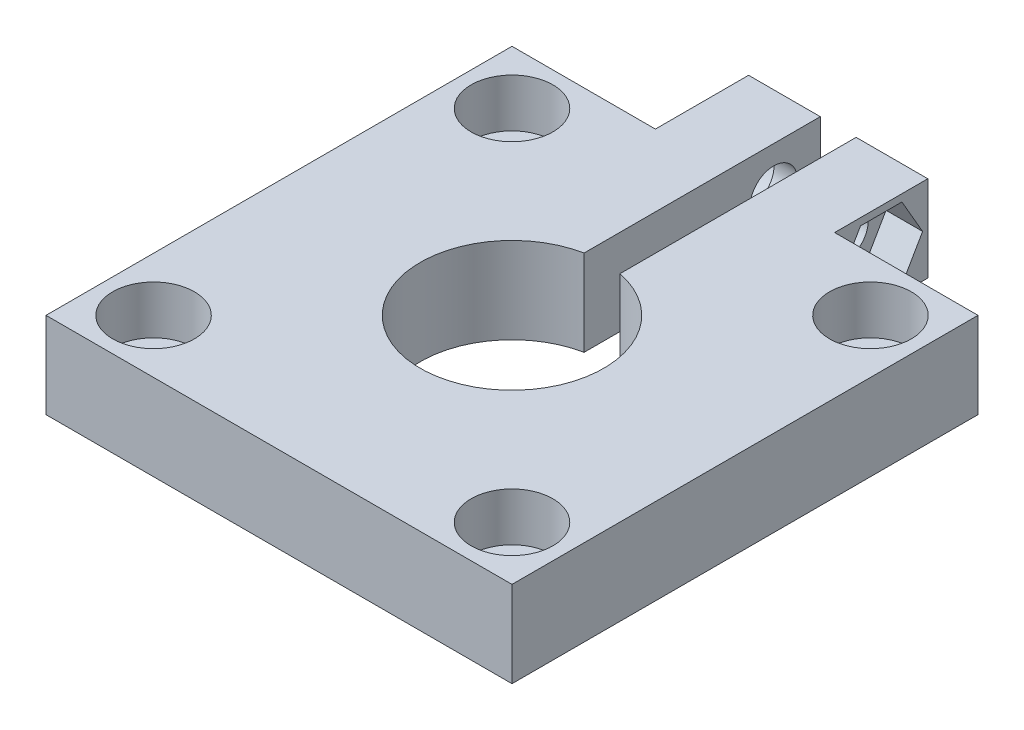
ISO-10303-21;
HEADER;
FILE_DESCRIPTION(('STEP AP214'),'2;1');
FILE_NAME('part.step','',(''),(''),'','','');
FILE_SCHEMA(('AUTOMOTIVE_DESIGN { 1 0 10303 214 1 1 1 1 }'));
ENDSEC;
DATA;
#1=APPLICATION_CONTEXT('core data for automotive mechanical design processes');
#2=APPLICATION_PROTOCOL_DEFINITION('international standard','automotive_design',2000,#1);
#3=PRODUCT_CONTEXT('',#1,'mechanical');
#4=PRODUCT('Part','Part','',(#3));
#5=PRODUCT_RELATED_PRODUCT_CATEGORY('part','',(#4));
#6=PRODUCT_DEFINITION_FORMATION('','',#4);
#7=PRODUCT_DEFINITION_CONTEXT('part definition',#1,'design');
#8=PRODUCT_DEFINITION('design','',#6,#7);
#9=PRODUCT_DEFINITION_SHAPE('','',#8);
#10=(LENGTH_UNIT() NAMED_UNIT(*) SI_UNIT(.MILLI.,.METRE.));
#11=(NAMED_UNIT(*) PLANE_ANGLE_UNIT() SI_UNIT($,.RADIAN.));
#12=(NAMED_UNIT(*) SI_UNIT($,.STERADIAN.) SOLID_ANGLE_UNIT());
#13=UNCERTAINTY_MEASURE_WITH_UNIT(LENGTH_MEASURE(1.E-05),#10,'distance_accuracy_value','');
#14=(GEOMETRIC_REPRESENTATION_CONTEXT(3) GLOBAL_UNCERTAINTY_ASSIGNED_CONTEXT((#13)) GLOBAL_UNIT_ASSIGNED_CONTEXT((#10,
#11,#12)) REPRESENTATION_CONTEXT('',''));
#15=CARTESIAN_POINT('',(0.,0.,0.));
#16=DIRECTION('',(0.,0.,1.));
#17=DIRECTION('',(1.,0.,0.));
#18=AXIS2_PLACEMENT_3D('',#15,#16,#17);
#19=CARTESIAN_POINT('',(-12.5,6.,-39.));
#20=DIRECTION('',(-1.,0.,0.));
#21=DIRECTION('',(0.,0.,1.));
#22=AXIS2_PLACEMENT_3D('',#19,#20,#21);
#23=CYLINDRICAL_SURFACE('',#22,3.3);
#24=CARTESIAN_POINT('',(2.5,6.,-39.));
#25=DIRECTION('',(1.,0.,0.));
#26=DIRECTION('',(0.,0.,-1.));
#27=AXIS2_PLACEMENT_3D('',#24,#25,#26);
#28=CIRCLE('',#27,3.3);
#29=CARTESIAN_POINT('',(2.5,6.,-42.3));
#30=VERTEX_POINT('',#29);
#31=EDGE_CURVE('E228',#30,#30,#28,.T.);
#32=ORIENTED_EDGE('',*,*,#31,.F.);
#33=EDGE_LOOP('',(#32));
#34=FACE_BOUND('',#33,.T.);
#35=CARTESIAN_POINT('',(7.4,6.,-39.));
#36=DIRECTION('',(1.,0.,0.));
#37=DIRECTION('',(0.,0.,-1.));
#38=AXIS2_PLACEMENT_3D('',#35,#36,#37);
#39=CIRCLE('',#38,3.3);
#40=CARTESIAN_POINT('',(7.4,6.,-42.3));
#41=VERTEX_POINT('',#40);
#42=EDGE_CURVE('E39',#41,#41,#39,.F.);
#43=ORIENTED_EDGE('',*,*,#42,.F.);
#44=EDGE_LOOP('',(#43));
#45=FACE_BOUND('',#44,.T.);
#46=ADVANCED_FACE('F35',(#34,#45),#23,.F.);
#47=CARTESIAN_POINT('',(-32.5,12.,-32.5));
#48=DIRECTION('',(0.,0.,1.));
#49=DIRECTION('',(1.,0.,0.));
#50=AXIS2_PLACEMENT_3D('',#47,#48,#49);
#51=PLANE('',#50);
#52=DIRECTION('',(-1.,0.,0.));
#53=VECTOR('',#52,1.);
#54=CARTESIAN_POINT('',(-32.5,0.,-32.5));
#55=LINE('',#54,#53);
#56=CARTESIAN_POINT('',(32.5,0.,-32.5));
#57=VERTEX_POINT('',#56);
#58=CARTESIAN_POINT('',(12.5,0.,-32.5));
#59=VERTEX_POINT('',#58);
#60=EDGE_CURVE('E303',#57,#59,#55,.T.);
#61=ORIENTED_EDGE('',*,*,#60,.T.);
#62=DIRECTION('',(0.,1.,0.));
#63=VECTOR('',#62,1.);
#64=CARTESIAN_POINT('',(12.5,0.,-32.5));
#65=LINE('',#64,#63);
#66=CARTESIAN_POINT('',(12.5,12.,-32.5));
#67=VERTEX_POINT('',#66);
#68=EDGE_CURVE('E59',#59,#67,#65,.T.);
#69=ORIENTED_EDGE('',*,*,#68,.T.);
#70=DIRECTION('',(-1.,0.,0.));
#71=VECTOR('',#70,1.);
#72=CARTESIAN_POINT('',(-32.5,12.,-32.5));
#73=LINE('',#72,#71);
#74=CARTESIAN_POINT('',(32.5,12.,-32.5));
#75=VERTEX_POINT('',#74);
#76=EDGE_CURVE('E293',#75,#67,#73,.T.);
#77=ORIENTED_EDGE('',*,*,#76,.F.);
#78=DIRECTION('',(0.,-1.,0.));
#79=VECTOR('',#78,1.);
#80=CARTESIAN_POINT('',(32.5,12.,-32.5));
#81=LINE('',#80,#79);
#82=EDGE_CURVE('E316',#75,#57,#81,.T.);
#83=ORIENTED_EDGE('',*,*,#82,.T.);
#84=EDGE_LOOP('',(#61,#69,#77,#83));
#85=FACE_BOUND('',#84,.T.);
#86=ADVANCED_FACE('F343',(#85),#51,.F.);
#87=CARTESIAN_POINT('',(32.5,12.,-32.5));
#88=DIRECTION('',(-1.,0.,0.));
#89=DIRECTION('',(0.,0.,1.));
#90=AXIS2_PLACEMENT_3D('',#87,#88,#89);
#91=PLANE('',#90);
#92=DIRECTION('',(0.,0.,-1.));
#93=VECTOR('',#92,1.);
#94=CARTESIAN_POINT('',(32.5,0.,-32.5));
#95=LINE('',#94,#93);
#96=CARTESIAN_POINT('',(32.5,0.,32.5));
#97=VERTEX_POINT('',#96);
#98=EDGE_CURVE('E285',#97,#57,#95,.T.);
#99=ORIENTED_EDGE('',*,*,#98,.T.);
#100=ORIENTED_EDGE('',*,*,#82,.F.);
#101=DIRECTION('',(0.,0.,-1.));
#102=VECTOR('',#101,1.);
#103=CARTESIAN_POINT('',(32.5,12.,-32.5));
#104=LINE('',#103,#102);
#105=CARTESIAN_POINT('',(32.5,12.,32.5));
#106=VERTEX_POINT('',#105);
#107=EDGE_CURVE('E288',#106,#75,#104,.T.);
#108=ORIENTED_EDGE('',*,*,#107,.F.);
#109=DIRECTION('',(0.,-1.,0.));
#110=VECTOR('',#109,1.);
#111=CARTESIAN_POINT('',(32.5,12.,32.5));
#112=LINE('',#111,#110);
#113=EDGE_CURVE('E299',#106,#97,#112,.T.);
#114=ORIENTED_EDGE('',*,*,#113,.T.);
#115=EDGE_LOOP('',(#99,#100,#108,#114));
#116=FACE_BOUND('',#115,.T.);
#117=ADVANCED_FACE('F37',(#116),#91,.F.);
#118=CARTESIAN_POINT('',(-12.5,12.,-32.5));
#119=VERTEX_POINT('',#118);
#120=CARTESIAN_POINT('',(-32.5,12.,-32.5));
#121=VERTEX_POINT('',#120);
#122=EDGE_CURVE('E291',#119,#121,#73,.T.);
#123=ORIENTED_EDGE('',*,*,#122,.F.);
#124=DIRECTION('',(0.,1.,0.));
#125=VECTOR('',#124,1.);
#126=CARTESIAN_POINT('',(-12.5,0.,-32.5));
#127=LINE('',#126,#125);
#128=CARTESIAN_POINT('',(-12.5,0.,-32.5));
#129=VERTEX_POINT('',#128);
#130=EDGE_CURVE('E265',#129,#119,#127,.T.);
#131=ORIENTED_EDGE('',*,*,#130,.F.);
#132=CARTESIAN_POINT('',(-32.5,0.,-32.5));
#133=VERTEX_POINT('',#132);
#134=EDGE_CURVE('E302',#129,#133,#55,.T.);
#135=ORIENTED_EDGE('',*,*,#134,.T.);
#136=DIRECTION('',(0.,-1.,0.));
#137=VECTOR('',#136,1.);
#138=CARTESIAN_POINT('',(-32.5,12.,-32.5));
#139=LINE('',#138,#137);
#140=EDGE_CURVE('E313',#121,#133,#139,.T.);
#141=ORIENTED_EDGE('',*,*,#140,.F.);
#142=EDGE_LOOP('',(#123,#131,#135,#141));
#143=FACE_BOUND('',#142,.T.);
#144=ADVANCED_FACE('F359',(#143),#51,.F.);
#145=CARTESIAN_POINT('',(-32.5,12.,-32.5));
#146=DIRECTION('',(1.,0.,0.));
#147=DIRECTION('',(0.,0.,-1.));
#148=AXIS2_PLACEMENT_3D('',#145,#146,#147);
#149=PLANE('',#148);
#150=DIRECTION('',(0.,0.,1.));
#151=VECTOR('',#150,1.);
#152=CARTESIAN_POINT('',(-32.5,0.,-32.5));
#153=LINE('',#152,#151);
#154=CARTESIAN_POINT('',(-32.5,0.,32.5));
#155=VERTEX_POINT('',#154);
#156=EDGE_CURVE('E305',#133,#155,#153,.T.);
#157=ORIENTED_EDGE('',*,*,#156,.T.);
#158=DIRECTION('',(0.,-1.,0.));
#159=VECTOR('',#158,1.);
#160=CARTESIAN_POINT('',(-32.5,12.,32.5));
#161=LINE('',#160,#159);
#162=CARTESIAN_POINT('',(-32.5,12.,32.5));
#163=VERTEX_POINT('',#162);
#164=EDGE_CURVE('E310',#163,#155,#161,.T.);
#165=ORIENTED_EDGE('',*,*,#164,.F.);
#166=DIRECTION('',(0.,0.,1.));
#167=VECTOR('',#166,1.);
#168=CARTESIAN_POINT('',(-32.5,12.,-32.5));
#169=LINE('',#168,#167);
#170=EDGE_CURVE('E295',#121,#163,#169,.T.);
#171=ORIENTED_EDGE('',*,*,#170,.F.);
#172=ORIENTED_EDGE('',*,*,#140,.T.);
#173=EDGE_LOOP('',(#157,#165,#171,#172));
#174=FACE_BOUND('',#173,.T.);
#175=ADVANCED_FACE('F356',(#174),#149,.F.);
#176=CARTESIAN_POINT('',(-32.5,12.,32.5));
#177=DIRECTION('',(0.,0.,-1.));
#178=DIRECTION('',(-1.,0.,0.));
#179=AXIS2_PLACEMENT_3D('',#176,#177,#178);
#180=PLANE('',#179);
#181=DIRECTION('',(1.,0.,0.));
#182=VECTOR('',#181,1.);
#183=CARTESIAN_POINT('',(-32.5,0.,32.5));
#184=LINE('',#183,#182);
#185=EDGE_CURVE('E292',#155,#97,#184,.T.);
#186=ORIENTED_EDGE('',*,*,#185,.T.);
#187=ORIENTED_EDGE('',*,*,#113,.F.);
#188=DIRECTION('',(1.,0.,0.));
#189=VECTOR('',#188,1.);
#190=CARTESIAN_POINT('',(-32.5,12.,32.5));
#191=LINE('',#190,#189);
#192=EDGE_CURVE('E297',#163,#106,#191,.T.);
#193=ORIENTED_EDGE('',*,*,#192,.F.);
#194=ORIENTED_EDGE('',*,*,#164,.T.);
#195=EDGE_LOOP('',(#186,#187,#193,#194));
#196=FACE_BOUND('',#195,.T.);
#197=ADVANCED_FACE('F351',(#196),#180,.F.);
#198=CARTESIAN_POINT('',(32.5,12.,32.5));
#199=DIRECTION('',(0.,1.,0.));
#200=DIRECTION('',(0.,0.,1.));
#201=AXIS2_PLACEMENT_3D('',#198,#199,#200);
#202=PLANE('',#201);
#203=CARTESIAN_POINT('',(-25.,12.,25.));
#204=DIRECTION('',(0.,1.,0.));
#205=DIRECTION('',(0.,0.,1.));
#206=AXIS2_PLACEMENT_3D('',#203,#204,#205);
#207=CIRCLE('',#206,5.7);
#208=CARTESIAN_POINT('',(-25.,12.,30.7));
#209=VERTEX_POINT('',#208);
#210=EDGE_CURVE('E513',#209,#209,#207,.T.);
#211=ORIENTED_EDGE('',*,*,#210,.F.);
#212=EDGE_LOOP('',(#211));
#213=FACE_BOUND('',#212,.T.);
#214=CARTESIAN_POINT('',(25.,12.,25.));
#215=DIRECTION('',(0.,1.,0.));
#216=DIRECTION('',(0.,0.,1.));
#217=AXIS2_PLACEMENT_3D('',#214,#215,#216);
#218=CIRCLE('',#217,5.7);
#219=CARTESIAN_POINT('',(25.,12.,30.7));
#220=VERTEX_POINT('',#219);
#221=EDGE_CURVE('E524',#220,#220,#218,.T.);
#222=ORIENTED_EDGE('',*,*,#221,.F.);
#223=EDGE_LOOP('',(#222));
#224=FACE_BOUND('',#223,.T.);
#225=CARTESIAN_POINT('',(25.,12.,-25.));
#226=DIRECTION('',(0.,1.,0.));
#227=DIRECTION('',(0.,0.,1.));
#228=AXIS2_PLACEMENT_3D('',#225,#226,#227);
#229=CIRCLE('',#228,5.7);
#230=CARTESIAN_POINT('',(25.,12.,-19.3));
#231=VERTEX_POINT('',#230);
#232=EDGE_CURVE('E536',#231,#231,#229,.T.);
#233=ORIENTED_EDGE('',*,*,#232,.F.);
#234=EDGE_LOOP('',(#233));
#235=FACE_BOUND('',#234,.T.);
#236=CARTESIAN_POINT('',(-25.,12.,-25.));
#237=DIRECTION('',(0.,1.,0.));
#238=DIRECTION('',(0.,0.,1.));
#239=AXIS2_PLACEMENT_3D('',#236,#237,#238);
#240=CIRCLE('',#239,5.7);
#241=CARTESIAN_POINT('',(-25.,12.,-19.3));
#242=VERTEX_POINT('',#241);
#243=EDGE_CURVE('E548',#242,#242,#240,.T.);
#244=ORIENTED_EDGE('',*,*,#243,.F.);
#245=EDGE_LOOP('',(#244));
#246=FACE_BOUND('',#245,.T.);
#247=DIRECTION('',(0.,0.,-1.));
#248=VECTOR('',#247,1.);
#249=CARTESIAN_POINT('',(2.5,12.,-52.5));
#250=LINE('',#249,#248);
#251=CARTESIAN_POINT('',(2.5,12.,-12.5534855717446));
#252=VERTEX_POINT('',#251);
#253=CARTESIAN_POINT('',(2.5,12.,-45.5));
#254=VERTEX_POINT('',#253);
#255=EDGE_CURVE('E268',#252,#254,#250,.T.);
#256=ORIENTED_EDGE('',*,*,#255,.F.);
#257=CARTESIAN_POINT('',(0.,12.,0.));
#258=DIRECTION('',(0.,1.,0.));
#259=DIRECTION('',(0.,0.,1.));
#260=AXIS2_PLACEMENT_3D('',#257,#258,#259);
#261=CIRCLE('',#260,12.8);
#262=CARTESIAN_POINT('',(-2.5,12.,-12.5534855717446));
#263=VERTEX_POINT('',#262);
#264=EDGE_CURVE('E279',#263,#252,#261,.T.);
#265=ORIENTED_EDGE('',*,*,#264,.F.);
#266=DIRECTION('',(0.,0.,1.));
#267=VECTOR('',#266,1.);
#268=CARTESIAN_POINT('',(-2.5,12.,-52.5));
#269=LINE('',#268,#267);
#270=CARTESIAN_POINT('',(-2.5,12.,-45.5));
#271=VERTEX_POINT('',#270);
#272=EDGE_CURVE('E276',#271,#263,#269,.T.);
#273=ORIENTED_EDGE('',*,*,#272,.F.);
#274=DIRECTION('',(-1.,0.,0.));
#275=VECTOR('',#274,1.);
#276=CARTESIAN_POINT('',(-2.5,12.,-45.5));
#277=LINE('',#276,#275);
#278=CARTESIAN_POINT('',(-12.5,12.,-45.5));
#279=VERTEX_POINT('',#278);
#280=EDGE_CURVE('E248',#271,#279,#277,.T.);
#281=ORIENTED_EDGE('',*,*,#280,.T.);
#282=DIRECTION('',(0.,0.,1.));
#283=VECTOR('',#282,1.);
#284=CARTESIAN_POINT('',(-12.5,12.,-32.5));
#285=LINE('',#284,#283);
#286=EDGE_CURVE('E257',#279,#119,#285,.T.);
#287=ORIENTED_EDGE('',*,*,#286,.T.);
#288=ORIENTED_EDGE('',*,*,#122,.T.);
#289=ORIENTED_EDGE('',*,*,#170,.T.);
#290=ORIENTED_EDGE('',*,*,#192,.T.);
#291=ORIENTED_EDGE('',*,*,#107,.T.);
#292=ORIENTED_EDGE('',*,*,#76,.T.);
#293=DIRECTION('',(0.,0.,-1.));
#294=VECTOR('',#293,1.);
#295=CARTESIAN_POINT('',(12.5,12.,-32.5));
#296=LINE('',#295,#294);
#297=CARTESIAN_POINT('',(12.5,12.,-45.5));
#298=VERTEX_POINT('',#297);
#299=EDGE_CURVE('E234',#67,#298,#296,.T.);
#300=ORIENTED_EDGE('',*,*,#299,.T.);
#301=DIRECTION('',(-1.,0.,0.));
#302=VECTOR('',#301,1.);
#303=CARTESIAN_POINT('',(12.5,12.,-45.5));
#304=LINE('',#303,#302);
#305=EDGE_CURVE('E239',#298,#254,#304,.T.);
#306=ORIENTED_EDGE('',*,*,#305,.T.);
#307=EDGE_LOOP('',(#256,#265,#273,#281,#287,#288,#289,#290,#291,#292,#300,#306));
#308=FACE_BOUND('',#307,.T.);
#309=ADVANCED_FACE('F327',(#213,#224,#235,#246,#308),#202,.T.);
#310=CARTESIAN_POINT('',(32.5,0.,32.5));
#311=DIRECTION('',(0.,1.,0.));
#312=DIRECTION('',(0.,0.,1.));
#313=AXIS2_PLACEMENT_3D('',#310,#311,#312);
#314=PLANE('',#313);
#315=CARTESIAN_POINT('',(-25.,0.,25.));
#316=DIRECTION('',(0.,1.,0.));
#317=DIRECTION('',(0.,0.,1.));
#318=AXIS2_PLACEMENT_3D('',#315,#316,#317);
#319=CIRCLE('',#318,3.75);
#320=CARTESIAN_POINT('',(-25.,0.,28.75));
#321=VERTEX_POINT('',#320);
#322=EDGE_CURVE('E521',#321,#321,#319,.T.);
#323=ORIENTED_EDGE('',*,*,#322,.T.);
#324=EDGE_LOOP('',(#323));
#325=FACE_BOUND('',#324,.T.);
#326=CARTESIAN_POINT('',(25.,0.,25.));
#327=DIRECTION('',(0.,1.,0.));
#328=DIRECTION('',(0.,0.,1.));
#329=AXIS2_PLACEMENT_3D('',#326,#327,#328);
#330=CIRCLE('',#329,3.75);
#331=CARTESIAN_POINT('',(25.,0.,28.75));
#332=VERTEX_POINT('',#331);
#333=EDGE_CURVE('E533',#332,#332,#330,.T.);
#334=ORIENTED_EDGE('',*,*,#333,.T.);
#335=EDGE_LOOP('',(#334));
#336=FACE_BOUND('',#335,.T.);
#337=CARTESIAN_POINT('',(25.,0.,-25.));
#338=DIRECTION('',(0.,1.,0.));
#339=DIRECTION('',(0.,0.,1.));
#340=AXIS2_PLACEMENT_3D('',#337,#338,#339);
#341=CIRCLE('',#340,3.75);
#342=CARTESIAN_POINT('',(25.,0.,-21.25));
#343=VERTEX_POINT('',#342);
#344=EDGE_CURVE('E545',#343,#343,#341,.T.);
#345=ORIENTED_EDGE('',*,*,#344,.T.);
#346=EDGE_LOOP('',(#345));
#347=FACE_BOUND('',#346,.T.);
#348=CARTESIAN_POINT('',(-25.,0.,-25.));
#349=DIRECTION('',(0.,1.,0.));
#350=DIRECTION('',(0.,0.,1.));
#351=AXIS2_PLACEMENT_3D('',#348,#349,#350);
#352=CIRCLE('',#351,3.75);
#353=CARTESIAN_POINT('',(-25.,0.,-21.25));
#354=VERTEX_POINT('',#353);
#355=EDGE_CURVE('E189',#354,#354,#352,.T.);
#356=ORIENTED_EDGE('',*,*,#355,.T.);
#357=EDGE_LOOP('',(#356));
#358=FACE_BOUND('',#357,.T.);
#359=CARTESIAN_POINT('',(0.,0.,0.));
#360=DIRECTION('',(0.,1.,0.));
#361=DIRECTION('',(0.,0.,1.));
#362=AXIS2_PLACEMENT_3D('',#359,#360,#361);
#363=CIRCLE('',#362,12.8);
#364=CARTESIAN_POINT('',(-2.5,0.,-12.5534855717446));
#365=VERTEX_POINT('',#364);
#366=CARTESIAN_POINT('',(2.5,0.,-12.5534855717446));
#367=VERTEX_POINT('',#366);
#368=EDGE_CURVE('E282',#365,#367,#363,.T.);
#369=ORIENTED_EDGE('',*,*,#368,.T.);
#370=DIRECTION('',(0.,0.,-1.));
#371=VECTOR('',#370,1.);
#372=CARTESIAN_POINT('',(2.5,0.,-52.5));
#373=LINE('',#372,#371);
#374=CARTESIAN_POINT('',(2.5,0.,-45.5));
#375=VERTEX_POINT('',#374);
#376=EDGE_CURVE('E273',#367,#375,#373,.T.);
#377=ORIENTED_EDGE('',*,*,#376,.T.);
#378=DIRECTION('',(-1.,0.,0.));
#379=VECTOR('',#378,1.);
#380=CARTESIAN_POINT('',(12.5,0.,-45.5));
#381=LINE('',#380,#379);
#382=CARTESIAN_POINT('',(12.5,0.,-45.5));
#383=VERTEX_POINT('',#382);
#384=EDGE_CURVE('E238',#383,#375,#381,.T.);
#385=ORIENTED_EDGE('',*,*,#384,.F.);
#386=DIRECTION('',(0.,0.,-1.));
#387=VECTOR('',#386,1.);
#388=CARTESIAN_POINT('',(12.5,0.,-32.5));
#389=LINE('',#388,#387);
#390=EDGE_CURVE('E235',#59,#383,#389,.T.);
#391=ORIENTED_EDGE('',*,*,#390,.F.);
#392=ORIENTED_EDGE('',*,*,#60,.F.);
#393=ORIENTED_EDGE('',*,*,#98,.F.);
#394=ORIENTED_EDGE('',*,*,#185,.F.);
#395=ORIENTED_EDGE('',*,*,#156,.F.);
#396=ORIENTED_EDGE('',*,*,#134,.F.);
#397=DIRECTION('',(0.,0.,1.));
#398=VECTOR('',#397,1.);
#399=CARTESIAN_POINT('',(-12.5,0.,-32.5));
#400=LINE('',#399,#398);
#401=CARTESIAN_POINT('',(-12.5,0.,-45.5));
#402=VERTEX_POINT('',#401);
#403=EDGE_CURVE('E256',#402,#129,#400,.T.);
#404=ORIENTED_EDGE('',*,*,#403,.F.);
#405=DIRECTION('',(-1.,0.,0.));
#406=VECTOR('',#405,1.);
#407=CARTESIAN_POINT('',(-2.5,0.,-45.5));
#408=LINE('',#407,#406);
#409=CARTESIAN_POINT('',(-2.5,0.,-45.5));
#410=VERTEX_POINT('',#409);
#411=EDGE_CURVE('E253',#410,#402,#408,.T.);
#412=ORIENTED_EDGE('',*,*,#411,.F.);
#413=DIRECTION('',(0.,0.,1.));
#414=VECTOR('',#413,1.);
#415=CARTESIAN_POINT('',(-2.5,0.,-52.5));
#416=LINE('',#415,#414);
#417=EDGE_CURVE('E275',#410,#365,#416,.T.);
#418=ORIENTED_EDGE('',*,*,#417,.T.);
#419=EDGE_LOOP('',(#369,#377,#385,#391,#392,#393,#394,#395,#396,#404,#412,#418));
#420=FACE_BOUND('',#419,.T.);
#421=ADVANCED_FACE('F337',(#325,#336,#347,#358,#420),#314,.F.);
#422=CARTESIAN_POINT('',(0.,0.,0.));
#423=DIRECTION('',(0.,1.,0.));
#424=DIRECTION('',(0.,0.,1.));
#425=AXIS2_PLACEMENT_3D('',#422,#423,#424);
#426=CYLINDRICAL_SURFACE('',#425,12.8);
#427=ORIENTED_EDGE('',*,*,#264,.T.);
#428=DIRECTION('',(0.,1.,0.));
#429=VECTOR('',#428,1.);
#430=CARTESIAN_POINT('',(2.5,0.,-12.5534855717446));
#431=LINE('',#430,#429);
#432=EDGE_CURVE('E11',#252,#367,#431,.F.);
#433=ORIENTED_EDGE('',*,*,#432,.T.);
#434=ORIENTED_EDGE('',*,*,#368,.F.);
#435=DIRECTION('',(0.,1.,0.));
#436=VECTOR('',#435,1.);
#437=CARTESIAN_POINT('',(-2.5,0.,-12.5534855717446));
#438=LINE('',#437,#436);
#439=EDGE_CURVE('E44',#365,#263,#438,.T.);
#440=ORIENTED_EDGE('',*,*,#439,.T.);
#441=EDGE_LOOP('',(#427,#433,#434,#440));
#442=FACE_BOUND('',#441,.T.);
#443=ADVANCED_FACE('F323',(#442),#426,.F.);
#444=CARTESIAN_POINT('',(-2.5,0.,-52.5));
#445=DIRECTION('',(-1.,0.,0.));
#446=DIRECTION('',(0.,0.,1.));
#447=AXIS2_PLACEMENT_3D('',#444,#445,#446);
#448=PLANE('',#447);
#449=CARTESIAN_POINT('',(-2.5,6.,-39.));
#450=DIRECTION('',(-1.,0.,0.));
#451=DIRECTION('',(0.,0.,1.));
#452=AXIS2_PLACEMENT_3D('',#449,#450,#451);
#453=CIRCLE('',#452,3.3);
#454=CARTESIAN_POINT('',(-2.5,6.,-35.7));
#455=VERTEX_POINT('',#454);
#456=EDGE_CURVE('E231',#455,#455,#453,.T.);
#457=ORIENTED_EDGE('',*,*,#456,.T.);
#458=EDGE_LOOP('',(#457));
#459=FACE_BOUND('',#458,.T.);
#460=ORIENTED_EDGE('',*,*,#272,.T.);
#461=ORIENTED_EDGE('',*,*,#439,.F.);
#462=ORIENTED_EDGE('',*,*,#417,.F.);
#463=DIRECTION('',(0.,1.,0.));
#464=VECTOR('',#463,1.);
#465=CARTESIAN_POINT('',(-2.5,0.,-45.5));
#466=LINE('',#465,#464);
#467=EDGE_CURVE('E260',#410,#271,#466,.T.);
#468=ORIENTED_EDGE('',*,*,#467,.T.);
#469=EDGE_LOOP('',(#460,#461,#462,#468));
#470=FACE_BOUND('',#469,.T.);
#471=ADVANCED_FACE('F369',(#459,#470),#448,.F.);
#472=CARTESIAN_POINT('',(2.5,0.,-52.5));
#473=DIRECTION('',(1.,0.,0.));
#474=DIRECTION('',(0.,0.,-1.));
#475=AXIS2_PLACEMENT_3D('',#472,#473,#474);
#476=PLANE('',#475);
#477=ORIENTED_EDGE('',*,*,#31,.T.);
#478=EDGE_LOOP('',(#477));
#479=FACE_BOUND('',#478,.T.);
#480=ORIENTED_EDGE('',*,*,#376,.F.);
#481=ORIENTED_EDGE('',*,*,#432,.F.);
#482=ORIENTED_EDGE('',*,*,#255,.T.);
#483=DIRECTION('',(0.,1.,0.));
#484=VECTOR('',#483,1.);
#485=CARTESIAN_POINT('',(2.5,0.,-45.5));
#486=LINE('',#485,#484);
#487=EDGE_CURVE('E249',#375,#254,#486,.T.);
#488=ORIENTED_EDGE('',*,*,#487,.F.);
#489=EDGE_LOOP('',(#480,#481,#482,#488));
#490=FACE_BOUND('',#489,.T.);
#491=ADVANCED_FACE('F331',(#479,#490),#476,.F.);
#492=CARTESIAN_POINT('',(-12.5,0.,-32.5));
#493=DIRECTION('',(-1.,0.,0.));
#494=DIRECTION('',(0.,0.,1.));
#495=AXIS2_PLACEMENT_3D('',#492,#493,#494);
#496=PLANE('',#495);
#497=CARTESIAN_POINT('',(-12.5,6.,-39.));
#498=DIRECTION('',(-1.,0.,0.));
#499=DIRECTION('',(0.,0.,1.));
#500=AXIS2_PLACEMENT_3D('',#497,#498,#499);
#501=CIRCLE('',#500,5.25);
#502=CARTESIAN_POINT('',(-12.5,6.,-33.75));
#503=VERTEX_POINT('',#502);
#504=EDGE_CURVE('E219',#503,#503,#501,.T.);
#505=ORIENTED_EDGE('',*,*,#504,.F.);
#506=EDGE_LOOP('',(#505));
#507=FACE_BOUND('',#506,.T.);
#508=ORIENTED_EDGE('',*,*,#286,.F.);
#509=DIRECTION('',(0.,1.,0.));
#510=VECTOR('',#509,1.);
#511=CARTESIAN_POINT('',(-12.5,0.,-45.5));
#512=LINE('',#511,#510);
#513=EDGE_CURVE('E269',#402,#279,#512,.T.);
#514=ORIENTED_EDGE('',*,*,#513,.F.);
#515=ORIENTED_EDGE('',*,*,#403,.T.);
#516=ORIENTED_EDGE('',*,*,#130,.T.);
#517=EDGE_LOOP('',(#508,#514,#515,#516));
#518=FACE_BOUND('',#517,.T.);
#519=ADVANCED_FACE('F364',(#507,#518),#496,.T.);
#520=CARTESIAN_POINT('',(-2.5,0.,-45.5));
#521=DIRECTION('',(0.,0.,-1.));
#522=DIRECTION('',(-1.,0.,0.));
#523=AXIS2_PLACEMENT_3D('',#520,#521,#522);
#524=PLANE('',#523);
#525=ORIENTED_EDGE('',*,*,#280,.F.);
#526=ORIENTED_EDGE('',*,*,#467,.F.);
#527=ORIENTED_EDGE('',*,*,#411,.T.);
#528=ORIENTED_EDGE('',*,*,#513,.T.);
#529=EDGE_LOOP('',(#525,#526,#527,#528));
#530=FACE_BOUND('',#529,.T.);
#531=ADVANCED_FACE('F367',(#530),#524,.T.);
#532=CARTESIAN_POINT('',(12.5,0.,-32.5));
#533=DIRECTION('',(1.,0.,0.));
#534=DIRECTION('',(0.,0.,-1.));
#535=AXIS2_PLACEMENT_3D('',#532,#533,#534);
#536=PLANE('',#535);
#537=DIRECTION('',(0.,0.866025403784439,-0.5));
#538=VECTOR('',#537,1.);
#539=CARTESIAN_POINT('',(12.5,1.,-41.8867513459481));
#540=LINE('',#539,#538);
#541=CARTESIAN_POINT('',(12.5,1.,-41.8867513459481));
#542=VERTEX_POINT('',#541);
#543=CARTESIAN_POINT('',(12.5,6.,-44.7735026918963));
#544=VERTEX_POINT('',#543);
#545=EDGE_CURVE('E51',#542,#544,#540,.T.);
#546=ORIENTED_EDGE('',*,*,#545,.F.);
#547=DIRECTION('',(0.,0.,-1.));
#548=VECTOR('',#547,1.);
#549=CARTESIAN_POINT('',(12.5,1.,-36.1132486540519));
#550=LINE('',#549,#548);
#551=CARTESIAN_POINT('',(12.5,1.,-36.1132486540519));
#552=VERTEX_POINT('',#551);
#553=EDGE_CURVE('E183',#552,#542,#550,.T.);
#554=ORIENTED_EDGE('',*,*,#553,.F.);
#555=DIRECTION('',(0.,-0.866025403784439,-0.5));
#556=VECTOR('',#555,1.);
#557=CARTESIAN_POINT('',(12.5,6.,-33.2264973081037));
#558=LINE('',#557,#556);
#559=CARTESIAN_POINT('',(12.5,6.,-33.2264973081037));
#560=VERTEX_POINT('',#559);
#561=EDGE_CURVE('E186',#560,#552,#558,.T.);
#562=ORIENTED_EDGE('',*,*,#561,.F.);
#563=DIRECTION('',(0.,-0.866025403784439,0.5));
#564=VECTOR('',#563,1.);
#565=CARTESIAN_POINT('',(12.5,11.,-36.1132486540519));
#566=LINE('',#565,#564);
#567=CARTESIAN_POINT('',(12.5,11.,-36.1132486540519));
#568=VERTEX_POINT('',#567);
#569=EDGE_CURVE('E205',#568,#560,#566,.T.);
#570=ORIENTED_EDGE('',*,*,#569,.F.);
#571=DIRECTION('',(0.,0.,1.));
#572=VECTOR('',#571,1.);
#573=CARTESIAN_POINT('',(12.5,11.,-41.8867513459481));
#574=LINE('',#573,#572);
#575=CARTESIAN_POINT('',(12.5,11.,-41.8867513459481));
#576=VERTEX_POINT('',#575);
#577=EDGE_CURVE('E202',#576,#568,#574,.T.);
#578=ORIENTED_EDGE('',*,*,#577,.F.);
#579=DIRECTION('',(0.,0.866025403784439,0.5));
#580=VECTOR('',#579,1.);
#581=CARTESIAN_POINT('',(12.5,6.,-44.7735026918963));
#582=LINE('',#581,#580);
#583=EDGE_CURVE('E200',#544,#576,#582,.T.);
#584=ORIENTED_EDGE('',*,*,#583,.F.);
#585=EDGE_LOOP('',(#546,#554,#562,#570,#578,#584));
#586=FACE_BOUND('',#585,.T.);
#587=ORIENTED_EDGE('',*,*,#299,.F.);
#588=ORIENTED_EDGE('',*,*,#68,.F.);
#589=ORIENTED_EDGE('',*,*,#390,.T.);
#590=DIRECTION('',(0.,1.,0.));
#591=VECTOR('',#590,1.);
#592=CARTESIAN_POINT('',(12.5,0.,-45.5));
#593=LINE('',#592,#591);
#594=EDGE_CURVE('E242',#383,#298,#593,.T.);
#595=ORIENTED_EDGE('',*,*,#594,.T.);
#596=EDGE_LOOP('',(#587,#588,#589,#595));
#597=FACE_BOUND('',#596,.T.);
#598=ADVANCED_FACE('F340',(#586,#597),#536,.T.);
#599=CARTESIAN_POINT('',(12.5,0.,-45.5));
#600=DIRECTION('',(0.,0.,-1.));
#601=DIRECTION('',(-1.,0.,0.));
#602=AXIS2_PLACEMENT_3D('',#599,#600,#601);
#603=PLANE('',#602);
#604=ORIENTED_EDGE('',*,*,#305,.F.);
#605=ORIENTED_EDGE('',*,*,#594,.F.);
#606=ORIENTED_EDGE('',*,*,#384,.T.);
#607=ORIENTED_EDGE('',*,*,#487,.T.);
#608=EDGE_LOOP('',(#604,#605,#606,#607));
#609=FACE_BOUND('',#608,.T.);
#610=ADVANCED_FACE('F333',(#609),#603,.T.);
#611=CARTESIAN_POINT('',(-5.75,6.,-39.));
#612=DIRECTION('',(-1.,0.,0.));
#613=DIRECTION('',(0.,0.,1.));
#614=AXIS2_PLACEMENT_3D('',#611,#612,#613);
#615=CIRCLE('',#614,3.3);
#616=CARTESIAN_POINT('',(-5.75,6.,-35.7));
#617=VERTEX_POINT('',#616);
#618=EDGE_CURVE('E225',#617,#617,#615,.T.);
#619=ORIENTED_EDGE('',*,*,#618,.T.);
#620=EDGE_LOOP('',(#619));
#621=FACE_BOUND('',#620,.T.);
#622=ORIENTED_EDGE('',*,*,#456,.F.);
#623=EDGE_LOOP('',(#622));
#624=FACE_BOUND('',#623,.T.);
#625=ADVANCED_FACE('F384',(#621,#624),#23,.F.);
#626=CARTESIAN_POINT('',(-5.75,9.3,-39.));
#627=DIRECTION('',(1.,0.,0.));
#628=DIRECTION('',(0.,0.,-1.));
#629=AXIS2_PLACEMENT_3D('',#626,#627,#628);
#630=PLANE('',#629);
#631=ORIENTED_EDGE('',*,*,#618,.F.);
#632=EDGE_LOOP('',(#631));
#633=FACE_BOUND('',#632,.T.);
#634=CARTESIAN_POINT('',(-5.75,6.,-39.));
#635=DIRECTION('',(-1.,0.,0.));
#636=DIRECTION('',(0.,0.,1.));
#637=AXIS2_PLACEMENT_3D('',#634,#635,#636);
#638=CIRCLE('',#637,5.25);
#639=CARTESIAN_POINT('',(-5.75,6.,-33.75));
#640=VERTEX_POINT('',#639);
#641=EDGE_CURVE('E222',#640,#640,#638,.T.);
#642=ORIENTED_EDGE('',*,*,#641,.T.);
#643=EDGE_LOOP('',(#642));
#644=FACE_BOUND('',#643,.T.);
#645=ADVANCED_FACE('F393',(#633,#644),#630,.F.);
#646=CARTESIAN_POINT('',(-12.5,6.,-39.));
#647=DIRECTION('',(-1.,0.,0.));
#648=DIRECTION('',(0.,0.,1.));
#649=AXIS2_PLACEMENT_3D('',#646,#647,#648);
#650=CYLINDRICAL_SURFACE('',#649,5.25);
#651=ORIENTED_EDGE('',*,*,#641,.F.);
#652=EDGE_LOOP('',(#651));
#653=FACE_BOUND('',#652,.T.);
#654=ORIENTED_EDGE('',*,*,#504,.T.);
#655=EDGE_LOOP('',(#654));
#656=FACE_BOUND('',#655,.T.);
#657=ADVANCED_FACE('F399',(#653,#656),#650,.F.);
#658=CARTESIAN_POINT('',(7.4,6.,-44.7735026918963));
#659=DIRECTION('',(1.,0.,0.));
#660=DIRECTION('',(0.,0.,-1.));
#661=AXIS2_PLACEMENT_3D('',#658,#659,#660);
#662=PLANE('',#661);
#663=DIRECTION('',(0.,0.866025403784439,-0.5));
#664=VECTOR('',#663,1.);
#665=CARTESIAN_POINT('',(7.4,1.,-41.8867513459481));
#666=LINE('',#665,#664);
#667=CARTESIAN_POINT('',(7.4,1.,-41.8867513459481));
#668=VERTEX_POINT('',#667);
#669=CARTESIAN_POINT('',(7.4,6.,-44.7735026918963));
#670=VERTEX_POINT('',#669);
#671=EDGE_CURVE('E163',#668,#670,#666,.T.);
#672=ORIENTED_EDGE('',*,*,#671,.T.);
#673=DIRECTION('',(0.,0.866025403784439,0.5));
#674=VECTOR('',#673,1.);
#675=CARTESIAN_POINT('',(7.4,6.,-44.7735026918963));
#676=LINE('',#675,#674);
#677=CARTESIAN_POINT('',(7.4,11.,-41.8867513459481));
#678=VERTEX_POINT('',#677);
#679=EDGE_CURVE('E172',#670,#678,#676,.T.);
#680=ORIENTED_EDGE('',*,*,#679,.T.);
#681=DIRECTION('',(0.,0.,1.));
#682=VECTOR('',#681,1.);
#683=CARTESIAN_POINT('',(7.4,11.,-41.8867513459481));
#684=LINE('',#683,#682);
#685=CARTESIAN_POINT('',(7.4,11.,-36.1132486540519));
#686=VERTEX_POINT('',#685);
#687=EDGE_CURVE('E177',#678,#686,#684,.T.);
#688=ORIENTED_EDGE('',*,*,#687,.T.);
#689=DIRECTION('',(0.,-0.866025403784439,0.5));
#690=VECTOR('',#689,1.);
#691=CARTESIAN_POINT('',(7.4,11.,-36.1132486540519));
#692=LINE('',#691,#690);
#693=CARTESIAN_POINT('',(7.4,6.,-33.2264973081037));
#694=VERTEX_POINT('',#693);
#695=EDGE_CURVE('E193',#686,#694,#692,.T.);
#696=ORIENTED_EDGE('',*,*,#695,.T.);
#697=DIRECTION('',(0.,-0.866025403784439,-0.5));
#698=VECTOR('',#697,1.);
#699=CARTESIAN_POINT('',(7.4,6.,-33.2264973081037));
#700=LINE('',#699,#698);
#701=CARTESIAN_POINT('',(7.4,1.,-36.1132486540519));
#702=VERTEX_POINT('',#701);
#703=EDGE_CURVE('E196',#694,#702,#700,.T.);
#704=ORIENTED_EDGE('',*,*,#703,.T.);
#705=DIRECTION('',(0.,0.,-1.));
#706=VECTOR('',#705,1.);
#707=CARTESIAN_POINT('',(7.4,1.,-36.1132486540519));
#708=LINE('',#707,#706);
#709=EDGE_CURVE('E169',#702,#668,#708,.T.);
#710=ORIENTED_EDGE('',*,*,#709,.T.);
#711=EDGE_LOOP('',(#672,#680,#688,#696,#704,#710));
#712=FACE_BOUND('',#711,.T.);
#713=ORIENTED_EDGE('',*,*,#42,.T.);
#714=EDGE_LOOP('',(#713));
#715=FACE_BOUND('',#714,.T.);
#716=ADVANCED_FACE('F179',(#712,#715),#662,.T.);
#717=CARTESIAN_POINT('',(7.4,1.,-41.8867513459481));
#718=DIRECTION('',(0.,-0.5,-0.866025403784439));
#719=DIRECTION('',(0.,0.866025403784439,-0.5));
#720=AXIS2_PLACEMENT_3D('',#717,#718,#719);
#721=PLANE('',#720);
#722=ORIENTED_EDGE('',*,*,#545,.T.);
#723=DIRECTION('',(1.,0.,0.));
#724=VECTOR('',#723,1.);
#725=CARTESIAN_POINT('',(7.4,6.,-44.7735026918963));
#726=LINE('',#725,#724);
#727=EDGE_CURVE('E159',#670,#544,#726,.T.);
#728=ORIENTED_EDGE('',*,*,#727,.F.);
#729=ORIENTED_EDGE('',*,*,#671,.F.);
#730=DIRECTION('',(1.,0.,0.));
#731=VECTOR('',#730,1.);
#732=CARTESIAN_POINT('',(7.4,1.,-41.8867513459481));
#733=LINE('',#732,#731);
#734=EDGE_CURVE('E210',#668,#542,#733,.T.);
#735=ORIENTED_EDGE('',*,*,#734,.T.);
#736=EDGE_LOOP('',(#722,#728,#729,#735));
#737=FACE_BOUND('',#736,.T.);
#738=ADVANCED_FACE('F161',(#737),#721,.F.);
#739=CARTESIAN_POINT('',(7.4,1.,-36.1132486540519));
#740=DIRECTION('',(0.,-1.,0.));
#741=DIRECTION('',(0.,0.,-1.));
#742=AXIS2_PLACEMENT_3D('',#739,#740,#741);
#743=PLANE('',#742);
#744=ORIENTED_EDGE('',*,*,#553,.T.);
#745=ORIENTED_EDGE('',*,*,#734,.F.);
#746=ORIENTED_EDGE('',*,*,#709,.F.);
#747=DIRECTION('',(1.,0.,0.));
#748=VECTOR('',#747,1.);
#749=CARTESIAN_POINT('',(7.4,1.,-36.1132486540519));
#750=LINE('',#749,#748);
#751=EDGE_CURVE('E212',#702,#552,#750,.T.);
#752=ORIENTED_EDGE('',*,*,#751,.T.);
#753=EDGE_LOOP('',(#744,#745,#746,#752));
#754=FACE_BOUND('',#753,.T.);
#755=ADVANCED_FACE('F435',(#754),#743,.F.);
#756=CARTESIAN_POINT('',(7.4,6.,-33.2264973081037));
#757=DIRECTION('',(0.,-0.5,0.866025403784439));
#758=DIRECTION('',(0.,-0.866025403784439,-0.5));
#759=AXIS2_PLACEMENT_3D('',#756,#757,#758);
#760=PLANE('',#759);
#761=ORIENTED_EDGE('',*,*,#561,.T.);
#762=ORIENTED_EDGE('',*,*,#751,.F.);
#763=ORIENTED_EDGE('',*,*,#703,.F.);
#764=DIRECTION('',(1.,0.,0.));
#765=VECTOR('',#764,1.);
#766=CARTESIAN_POINT('',(7.4,6.,-33.2264973081037));
#767=LINE('',#766,#765);
#768=EDGE_CURVE('E214',#694,#560,#767,.T.);
#769=ORIENTED_EDGE('',*,*,#768,.T.);
#770=EDGE_LOOP('',(#761,#762,#763,#769));
#771=FACE_BOUND('',#770,.T.);
#772=ADVANCED_FACE('F433',(#771),#760,.F.);
#773=CARTESIAN_POINT('',(7.4,11.,-36.1132486540519));
#774=DIRECTION('',(0.,0.5,0.866025403784439));
#775=DIRECTION('',(0.,-0.866025403784439,0.5));
#776=AXIS2_PLACEMENT_3D('',#773,#774,#775);
#777=PLANE('',#776);
#778=ORIENTED_EDGE('',*,*,#569,.T.);
#779=ORIENTED_EDGE('',*,*,#768,.F.);
#780=ORIENTED_EDGE('',*,*,#695,.F.);
#781=DIRECTION('',(1.,0.,0.));
#782=VECTOR('',#781,1.);
#783=CARTESIAN_POINT('',(7.4,11.,-36.1132486540519));
#784=LINE('',#783,#782);
#785=EDGE_CURVE('E216',#686,#568,#784,.T.);
#786=ORIENTED_EDGE('',*,*,#785,.T.);
#787=EDGE_LOOP('',(#778,#779,#780,#786));
#788=FACE_BOUND('',#787,.T.);
#789=ADVANCED_FACE('F431',(#788),#777,.F.);
#790=CARTESIAN_POINT('',(7.4,11.,-41.8867513459481));
#791=DIRECTION('',(0.,1.,0.));
#792=DIRECTION('',(0.,0.,1.));
#793=AXIS2_PLACEMENT_3D('',#790,#791,#792);
#794=PLANE('',#793);
#795=ORIENTED_EDGE('',*,*,#577,.T.);
#796=ORIENTED_EDGE('',*,*,#785,.F.);
#797=ORIENTED_EDGE('',*,*,#687,.F.);
#798=DIRECTION('',(1.,0.,0.));
#799=VECTOR('',#798,1.);
#800=CARTESIAN_POINT('',(7.4,11.,-41.8867513459481));
#801=LINE('',#800,#799);
#802=EDGE_CURVE('E168',#678,#576,#801,.T.);
#803=ORIENTED_EDGE('',*,*,#802,.T.);
#804=EDGE_LOOP('',(#795,#796,#797,#803));
#805=FACE_BOUND('',#804,.T.);
#806=ADVANCED_FACE('F427',(#805),#794,.F.);
#807=CARTESIAN_POINT('',(7.4,6.,-44.7735026918963));
#808=DIRECTION('',(0.,0.5,-0.866025403784439));
#809=DIRECTION('',(0.,0.866025403784439,0.5));
#810=AXIS2_PLACEMENT_3D('',#807,#808,#809);
#811=PLANE('',#810);
#812=ORIENTED_EDGE('',*,*,#583,.T.);
#813=ORIENTED_EDGE('',*,*,#802,.F.);
#814=ORIENTED_EDGE('',*,*,#679,.F.);
#815=ORIENTED_EDGE('',*,*,#727,.T.);
#816=EDGE_LOOP('',(#812,#813,#814,#815));
#817=FACE_BOUND('',#816,.T.);
#818=ADVANCED_FACE('F173',(#817),#811,.F.);
#819=CARTESIAN_POINT('',(-25.,12.,-25.));
#820=DIRECTION('',(0.,1.,0.));
#821=DIRECTION('',(0.,0.,1.));
#822=AXIS2_PLACEMENT_3D('',#819,#820,#821);
#823=CYLINDRICAL_SURFACE('',#822,3.75);
#824=ORIENTED_EDGE('',*,*,#355,.F.);
#825=EDGE_LOOP('',(#824));
#826=FACE_BOUND('',#825,.T.);
#827=CARTESIAN_POINT('',(-25.,5.25,-25.));
#828=DIRECTION('',(0.,1.,0.));
#829=DIRECTION('',(0.,0.,1.));
#830=AXIS2_PLACEMENT_3D('',#827,#828,#829);
#831=CIRCLE('',#830,3.75);
#832=CARTESIAN_POINT('',(-25.,5.25,-21.25));
#833=VERTEX_POINT('',#832);
#834=EDGE_CURVE('E553',#833,#833,#831,.T.);
#835=ORIENTED_EDGE('',*,*,#834,.T.);
#836=EDGE_LOOP('',(#835));
#837=FACE_BOUND('',#836,.T.);
#838=ADVANCED_FACE('F452',(#826,#837),#823,.F.);
#839=CARTESIAN_POINT('',(-21.25,5.25,-25.));
#840=DIRECTION('',(0.,-1.,0.));
#841=DIRECTION('',(0.,0.,-1.));
#842=AXIS2_PLACEMENT_3D('',#839,#840,#841);
#843=PLANE('',#842);
#844=ORIENTED_EDGE('',*,*,#834,.F.);
#845=EDGE_LOOP('',(#844));
#846=FACE_BOUND('',#845,.T.);
#847=CARTESIAN_POINT('',(-25.,5.25,-25.));
#848=DIRECTION('',(0.,1.,0.));
#849=DIRECTION('',(0.,0.,1.));
#850=AXIS2_PLACEMENT_3D('',#847,#848,#849);
#851=CIRCLE('',#850,5.7);
#852=CARTESIAN_POINT('',(-25.,5.25,-19.3));
#853=VERTEX_POINT('',#852);
#854=EDGE_CURVE('E551',#853,#853,#851,.T.);
#855=ORIENTED_EDGE('',*,*,#854,.T.);
#856=EDGE_LOOP('',(#855));
#857=FACE_BOUND('',#856,.T.);
#858=ADVANCED_FACE('F456',(#846,#857),#843,.F.);
#859=CARTESIAN_POINT('',(-25.,12.,-25.));
#860=DIRECTION('',(0.,1.,0.));
#861=DIRECTION('',(0.,0.,1.));
#862=AXIS2_PLACEMENT_3D('',#859,#860,#861);
#863=CYLINDRICAL_SURFACE('',#862,5.7);
#864=ORIENTED_EDGE('',*,*,#854,.F.);
#865=EDGE_LOOP('',(#864));
#866=FACE_BOUND('',#865,.T.);
#867=ORIENTED_EDGE('',*,*,#243,.T.);
#868=EDGE_LOOP('',(#867));
#869=FACE_BOUND('',#868,.T.);
#870=ADVANCED_FACE('F461',(#866,#869),#863,.F.);
#871=CARTESIAN_POINT('',(25.,12.,-25.));
#872=DIRECTION('',(0.,1.,0.));
#873=DIRECTION('',(0.,0.,1.));
#874=AXIS2_PLACEMENT_3D('',#871,#872,#873);
#875=CYLINDRICAL_SURFACE('',#874,3.75000000000001);
#876=ORIENTED_EDGE('',*,*,#344,.F.);
#877=EDGE_LOOP('',(#876));
#878=FACE_BOUND('',#877,.T.);
#879=CARTESIAN_POINT('',(25.,5.25,-25.));
#880=DIRECTION('',(0.,1.,0.));
#881=DIRECTION('',(0.,0.,1.));
#882=AXIS2_PLACEMENT_3D('',#879,#880,#881);
#883=CIRCLE('',#882,3.75000000000001);
#884=CARTESIAN_POINT('',(25.,5.25,-21.25));
#885=VERTEX_POINT('',#884);
#886=EDGE_CURVE('E542',#885,#885,#883,.T.);
#887=ORIENTED_EDGE('',*,*,#886,.T.);
#888=EDGE_LOOP('',(#887));
#889=FACE_BOUND('',#888,.T.);
#890=ADVANCED_FACE('F469',(#878,#889),#875,.F.);
#891=CARTESIAN_POINT('',(28.75,5.25,-25.));
#892=DIRECTION('',(0.,-1.,0.));
#893=DIRECTION('',(0.,0.,-1.));
#894=AXIS2_PLACEMENT_3D('',#891,#892,#893);
#895=PLANE('',#894);
#896=ORIENTED_EDGE('',*,*,#886,.F.);
#897=EDGE_LOOP('',(#896));
#898=FACE_BOUND('',#897,.T.);
#899=CARTESIAN_POINT('',(25.,5.25,-25.));
#900=DIRECTION('',(0.,1.,0.));
#901=DIRECTION('',(0.,0.,1.));
#902=AXIS2_PLACEMENT_3D('',#899,#900,#901);
#903=CIRCLE('',#902,5.7);
#904=CARTESIAN_POINT('',(25.,5.25,-19.3));
#905=VERTEX_POINT('',#904);
#906=EDGE_CURVE('E539',#905,#905,#903,.T.);
#907=ORIENTED_EDGE('',*,*,#906,.T.);
#908=EDGE_LOOP('',(#907));
#909=FACE_BOUND('',#908,.T.);
#910=ADVANCED_FACE('F473',(#898,#909),#895,.F.);
#911=CARTESIAN_POINT('',(25.,12.,-25.));
#912=DIRECTION('',(0.,1.,0.));
#913=DIRECTION('',(0.,0.,1.));
#914=AXIS2_PLACEMENT_3D('',#911,#912,#913);
#915=CYLINDRICAL_SURFACE('',#914,5.7);
#916=ORIENTED_EDGE('',*,*,#906,.F.);
#917=EDGE_LOOP('',(#916));
#918=FACE_BOUND('',#917,.T.);
#919=ORIENTED_EDGE('',*,*,#232,.T.);
#920=EDGE_LOOP('',(#919));
#921=FACE_BOUND('',#920,.T.);
#922=ADVANCED_FACE('F477',(#918,#921),#915,.F.);
#923=CARTESIAN_POINT('',(25.,12.,25.));
#924=DIRECTION('',(0.,1.,0.));
#925=DIRECTION('',(0.,0.,1.));
#926=AXIS2_PLACEMENT_3D('',#923,#924,#925);
#927=CYLINDRICAL_SURFACE('',#926,3.75000000000001);
#928=ORIENTED_EDGE('',*,*,#333,.F.);
#929=EDGE_LOOP('',(#928));
#930=FACE_BOUND('',#929,.T.);
#931=CARTESIAN_POINT('',(25.,5.25,25.));
#932=DIRECTION('',(0.,1.,0.));
#933=DIRECTION('',(0.,0.,1.));
#934=AXIS2_PLACEMENT_3D('',#931,#932,#933);
#935=CIRCLE('',#934,3.75000000000001);
#936=CARTESIAN_POINT('',(25.,5.25,28.75));
#937=VERTEX_POINT('',#936);
#938=EDGE_CURVE('E530',#937,#937,#935,.T.);
#939=ORIENTED_EDGE('',*,*,#938,.T.);
#940=EDGE_LOOP('',(#939));
#941=FACE_BOUND('',#940,.T.);
#942=ADVANCED_FACE('F481',(#930,#941),#927,.F.);
#943=CARTESIAN_POINT('',(28.75,5.25,25.));
#944=DIRECTION('',(0.,-1.,0.));
#945=DIRECTION('',(0.,0.,-1.));
#946=AXIS2_PLACEMENT_3D('',#943,#944,#945);
#947=PLANE('',#946);
#948=ORIENTED_EDGE('',*,*,#938,.F.);
#949=EDGE_LOOP('',(#948));
#950=FACE_BOUND('',#949,.T.);
#951=CARTESIAN_POINT('',(25.,5.25,25.));
#952=DIRECTION('',(0.,1.,0.));
#953=DIRECTION('',(0.,0.,1.));
#954=AXIS2_PLACEMENT_3D('',#951,#952,#953);
#955=CIRCLE('',#954,5.7);
#956=CARTESIAN_POINT('',(25.,5.25,30.7));
#957=VERTEX_POINT('',#956);
#958=EDGE_CURVE('E527',#957,#957,#955,.T.);
#959=ORIENTED_EDGE('',*,*,#958,.T.);
#960=EDGE_LOOP('',(#959));
#961=FACE_BOUND('',#960,.T.);
#962=ADVANCED_FACE('F485',(#950,#961),#947,.F.);
#963=CARTESIAN_POINT('',(25.,12.,25.));
#964=DIRECTION('',(0.,1.,0.));
#965=DIRECTION('',(0.,0.,1.));
#966=AXIS2_PLACEMENT_3D('',#963,#964,#965);
#967=CYLINDRICAL_SURFACE('',#966,5.7);
#968=ORIENTED_EDGE('',*,*,#958,.F.);
#969=EDGE_LOOP('',(#968));
#970=FACE_BOUND('',#969,.T.);
#971=ORIENTED_EDGE('',*,*,#221,.T.);
#972=EDGE_LOOP('',(#971));
#973=FACE_BOUND('',#972,.T.);
#974=ADVANCED_FACE('F489',(#970,#973),#967,.F.);
#975=CARTESIAN_POINT('',(-25.,12.,25.));
#976=DIRECTION('',(0.,1.,0.));
#977=DIRECTION('',(0.,0.,1.));
#978=AXIS2_PLACEMENT_3D('',#975,#976,#977);
#979=CYLINDRICAL_SURFACE('',#978,3.75000000000001);
#980=ORIENTED_EDGE('',*,*,#322,.F.);
#981=EDGE_LOOP('',(#980));
#982=FACE_BOUND('',#981,.T.);
#983=CARTESIAN_POINT('',(-25.,5.25,25.));
#984=DIRECTION('',(0.,1.,0.));
#985=DIRECTION('',(0.,0.,1.));
#986=AXIS2_PLACEMENT_3D('',#983,#984,#985);
#987=CIRCLE('',#986,3.75000000000001);
#988=CARTESIAN_POINT('',(-25.,5.25,28.75));
#989=VERTEX_POINT('',#988);
#990=EDGE_CURVE('E516',#989,#989,#987,.T.);
#991=ORIENTED_EDGE('',*,*,#990,.T.);
#992=EDGE_LOOP('',(#991));
#993=FACE_BOUND('',#992,.T.);
#994=ADVANCED_FACE('F493',(#982,#993),#979,.F.);
#995=CARTESIAN_POINT('',(-21.25,5.25,25.));
#996=DIRECTION('',(0.,-1.,0.));
#997=DIRECTION('',(0.,0.,-1.));
#998=AXIS2_PLACEMENT_3D('',#995,#996,#997);
#999=PLANE('',#998);
#1000=ORIENTED_EDGE('',*,*,#990,.F.);
#1001=EDGE_LOOP('',(#1000));
#1002=FACE_BOUND('',#1001,.T.);
#1003=CARTESIAN_POINT('',(-25.,5.25,25.));
#1004=DIRECTION('',(0.,1.,0.));
#1005=DIRECTION('',(0.,0.,1.));
#1006=AXIS2_PLACEMENT_3D('',#1003,#1004,#1005);
#1007=CIRCLE('',#1006,5.7);
#1008=CARTESIAN_POINT('',(-25.,5.25,30.7));
#1009=VERTEX_POINT('',#1008);
#1010=EDGE_CURVE('E510',#1009,#1009,#1007,.T.);
#1011=ORIENTED_EDGE('',*,*,#1010,.T.);
#1012=EDGE_LOOP('',(#1011));
#1013=FACE_BOUND('',#1012,.T.);
#1014=ADVANCED_FACE('F497',(#1002,#1013),#999,.F.);
#1015=CARTESIAN_POINT('',(-25.,12.,25.));
#1016=DIRECTION('',(0.,1.,0.));
#1017=DIRECTION('',(0.,0.,1.));
#1018=AXIS2_PLACEMENT_3D('',#1015,#1016,#1017);
#1019=CYLINDRICAL_SURFACE('',#1018,5.7);
#1020=ORIENTED_EDGE('',*,*,#1010,.F.);
#1021=EDGE_LOOP('',(#1020));
#1022=FACE_BOUND('',#1021,.T.);
#1023=ORIENTED_EDGE('',*,*,#210,.T.);
#1024=EDGE_LOOP('',(#1023));
#1025=FACE_BOUND('',#1024,.T.);
#1026=ADVANCED_FACE('F501',(#1022,#1025),#1019,.F.);
#1027=CLOSED_SHELL('',(#46,#86,#117,#144,#175,#197,#309,#421,#443,#471,#491,#519,#531,#598,#610,
#625,#645,#657,#716,#738,#755,#772,#789,#806,#818,#838,#858,#870,#890,#910,#922,#942,#962,#974,
#994,#1014,#1026));
#1028=MANIFOLD_SOLID_BREP('B2',#1027);
#1029=ADVANCED_BREP_SHAPE_REPRESENTATION('',(#18,#1028),#14);
#1030=SHAPE_DEFINITION_REPRESENTATION(#9,#1029);
ENDSEC;
END-ISO-10303-21;
